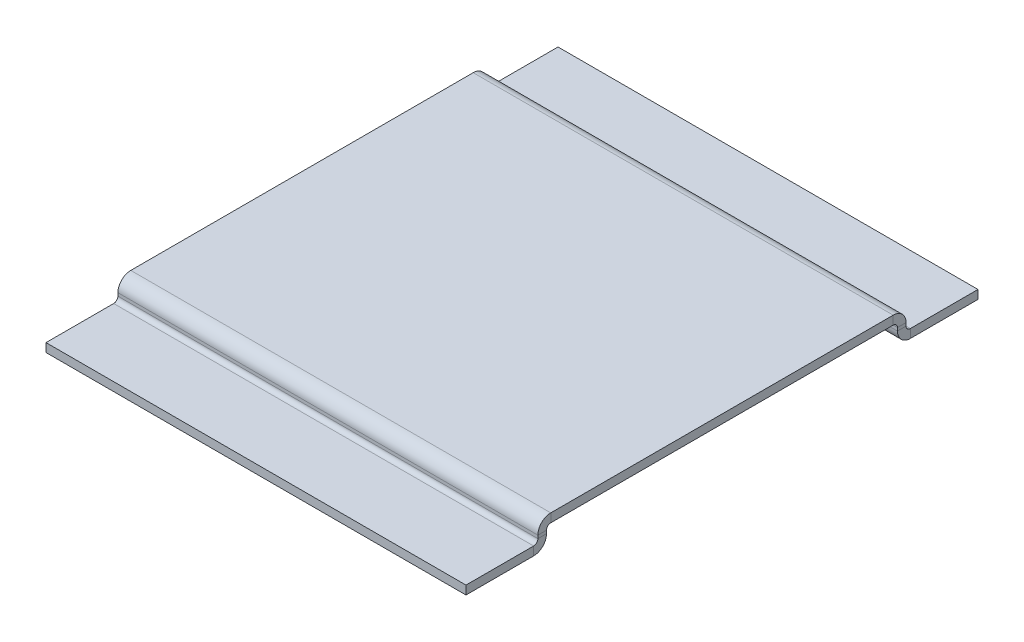
ISO-10303-21;
HEADER;
FILE_DESCRIPTION(('STEP AP214'),'2;1');
FILE_NAME('part.step','',(''),(''),'','','');
FILE_SCHEMA(('AUTOMOTIVE_DESIGN { 1 0 10303 214 1 1 1 1 }'));
ENDSEC;
DATA;
#1=APPLICATION_CONTEXT('core data for automotive mechanical design processes');
#2=APPLICATION_PROTOCOL_DEFINITION('international standard','automotive_design',2000,#1);
#3=PRODUCT_CONTEXT('',#1,'mechanical');
#4=PRODUCT('Part','Part','',(#3));
#5=PRODUCT_RELATED_PRODUCT_CATEGORY('part','',(#4));
#6=PRODUCT_DEFINITION_FORMATION('','',#4);
#7=PRODUCT_DEFINITION_CONTEXT('part definition',#1,'design');
#8=PRODUCT_DEFINITION('design','',#6,#7);
#9=PRODUCT_DEFINITION_SHAPE('','',#8);
#10=(LENGTH_UNIT() NAMED_UNIT(*) SI_UNIT(.MILLI.,.METRE.));
#11=(NAMED_UNIT(*) PLANE_ANGLE_UNIT() SI_UNIT($,.RADIAN.));
#12=(NAMED_UNIT(*) SI_UNIT($,.STERADIAN.) SOLID_ANGLE_UNIT());
#13=UNCERTAINTY_MEASURE_WITH_UNIT(LENGTH_MEASURE(1.E-05),#10,'distance_accuracy_value','');
#14=(GEOMETRIC_REPRESENTATION_CONTEXT(3) GLOBAL_UNCERTAINTY_ASSIGNED_CONTEXT((#13)) GLOBAL_UNIT_ASSIGNED_CONTEXT((#10,
#11,#12)) REPRESENTATION_CONTEXT('',''));
#15=CARTESIAN_POINT('',(0.,0.,0.));
#16=DIRECTION('',(0.,0.,1.));
#17=DIRECTION('',(1.,0.,0.));
#18=AXIS2_PLACEMENT_3D('',#15,#16,#17);
#19=CARTESIAN_POINT('',(-36.5,-1.49999999999999,-32.));
#20=DIRECTION('',(-1.,0.,0.));
#21=DIRECTION('',(0.,0.,1.));
#22=AXIS2_PLACEMENT_3D('',#19,#20,#21);
#23=PLANE('',#22);
#24=DIRECTION('',(0.,1.,0.));
#25=VECTOR('',#24,1.);
#26=CARTESIAN_POINT('',(-36.5,-1.49999999999999,-32.));
#27=LINE('',#26,#25);
#28=CARTESIAN_POINT('',(-36.5,-2.23659999999999,-32.));
#29=VERTEX_POINT('',#28);
#30=CARTESIAN_POINT('',(-36.5,-2.7634,-32.));
#31=VERTEX_POINT('',#30);
#32=EDGE_CURVE('E375',#29,#31,#27,.F.);
#33=ORIENTED_EDGE('',*,*,#32,.T.);
#34=DIRECTION('',(0.,0.,1.));
#35=VECTOR('',#34,1.);
#36=CARTESIAN_POINT('',(-36.5,-2.7634,-32.));
#37=LINE('',#36,#35);
#38=CARTESIAN_POINT('',(-36.5,-2.76340000000001,-30.5));
#39=VERTEX_POINT('',#38);
#40=EDGE_CURVE('E306',#31,#39,#37,.T.);
#41=ORIENTED_EDGE('',*,*,#40,.T.);
#42=DIRECTION('',(0.,-1.,0.));
#43=VECTOR('',#42,1.);
#44=CARTESIAN_POINT('',(-36.5,1.26882631385732E-13,-30.5));
#45=LINE('',#44,#43);
#46=CARTESIAN_POINT('',(-36.5,-2.2366,-30.5));
#47=VERTEX_POINT('',#46);
#48=EDGE_CURVE('E380',#47,#39,#45,.T.);
#49=ORIENTED_EDGE('',*,*,#48,.F.);
#50=DIRECTION('',(0.,0.,-1.));
#51=VECTOR('',#50,1.);
#52=CARTESIAN_POINT('',(-36.5,-2.23659999999999,-32.));
#53=LINE('',#52,#51);
#54=EDGE_CURVE('E370',#47,#29,#53,.T.);
#55=ORIENTED_EDGE('',*,*,#54,.T.);
#56=EDGE_LOOP('',(#33,#41,#49,#55));
#57=FACE_BOUND('',#56,.T.);
#58=ADVANCED_FACE('F119',(#57),#23,.T.);
#59=CARTESIAN_POINT('',(0.,1.32119853393997E-13,-32.));
#60=DIRECTION('',(0.,0.,1.));
#61=DIRECTION('',(0.,-1.,0.));
#62=AXIS2_PLACEMENT_3D('',#59,#60,#61);
#63=PLANE('',#62);
#64=DIRECTION('',(-1.,0.,0.));
#65=VECTOR('',#64,1.);
#66=CARTESIAN_POINT('',(-36.5,-2.7634,-32.));
#67=LINE('',#66,#65);
#68=CARTESIAN_POINT('',(36.5,-2.7634,-32.));
#69=VERTEX_POINT('',#68);
#70=EDGE_CURVE('E312',#31,#69,#67,.F.);
#71=ORIENTED_EDGE('',*,*,#70,.F.);
#72=ORIENTED_EDGE('',*,*,#32,.F.);
#73=DIRECTION('',(1.,0.,0.));
#74=VECTOR('',#73,1.);
#75=CARTESIAN_POINT('',(-36.5,-2.23659999999999,-32.));
#76=LINE('',#75,#74);
#77=CARTESIAN_POINT('',(36.5,-2.23659999999999,-32.));
#78=VERTEX_POINT('',#77);
#79=EDGE_CURVE('E383',#78,#29,#76,.F.);
#80=ORIENTED_EDGE('',*,*,#79,.F.);
#81=DIRECTION('',(0.,-1.,0.));
#82=VECTOR('',#81,1.);
#83=CARTESIAN_POINT('',(36.5,-5.,-32.));
#84=LINE('',#83,#82);
#85=EDGE_CURVE('E372',#69,#78,#84,.F.);
#86=ORIENTED_EDGE('',*,*,#85,.F.);
#87=EDGE_LOOP('',(#71,#72,#80,#86));
#88=FACE_BOUND('',#87,.T.);
#89=ADVANCED_FACE('F507',(#88),#63,.F.);
#90=CARTESIAN_POINT('',(0.,1.26882631385732E-13,-30.5));
#91=DIRECTION('',(0.,0.,1.));
#92=DIRECTION('',(0.,-1.,0.));
#93=AXIS2_PLACEMENT_3D('',#90,#91,#92);
#94=PLANE('',#93);
#95=ORIENTED_EDGE('',*,*,#48,.T.);
#96=DIRECTION('',(-1.,0.,0.));
#97=VECTOR('',#96,1.);
#98=CARTESIAN_POINT('',(-36.5,-2.76340000000001,-30.5));
#99=LINE('',#98,#97);
#100=CARTESIAN_POINT('',(36.5,-2.7634,-30.5));
#101=VERTEX_POINT('',#100);
#102=EDGE_CURVE('E301',#39,#101,#99,.F.);
#103=ORIENTED_EDGE('',*,*,#102,.T.);
#104=DIRECTION('',(0.,1.,0.));
#105=VECTOR('',#104,1.);
#106=CARTESIAN_POINT('',(36.5,1.26882631385732E-13,-30.5));
#107=LINE('',#106,#105);
#108=CARTESIAN_POINT('',(36.5,-2.2366,-30.5));
#109=VERTEX_POINT('',#108);
#110=EDGE_CURVE('E378',#101,#109,#107,.T.);
#111=ORIENTED_EDGE('',*,*,#110,.T.);
#112=DIRECTION('',(1.,0.,0.));
#113=VECTOR('',#112,1.);
#114=CARTESIAN_POINT('',(-36.5,-2.2366,-30.5));
#115=LINE('',#114,#113);
#116=EDGE_CURVE('E388',#47,#109,#115,.T.);
#117=ORIENTED_EDGE('',*,*,#116,.F.);
#118=EDGE_LOOP('',(#95,#103,#111,#117));
#119=FACE_BOUND('',#118,.T.);
#120=ADVANCED_FACE('F492',(#119),#94,.T.);
#121=CARTESIAN_POINT('',(36.5,-5.,32.));
#122=DIRECTION('',(1.,0.,0.));
#123=DIRECTION('',(0.,0.,-1.));
#124=AXIS2_PLACEMENT_3D('',#121,#122,#123);
#125=PLANE('',#124);
#126=DIRECTION('',(0.,-1.,0.));
#127=VECTOR('',#126,1.);
#128=CARTESIAN_POINT('',(36.5,-5.,32.));
#129=LINE('',#128,#127);
#130=CARTESIAN_POINT('',(36.5,-2.23659999999999,32.));
#131=VERTEX_POINT('',#130);
#132=CARTESIAN_POINT('',(36.5,-2.7634,32.));
#133=VERTEX_POINT('',#132);
#134=EDGE_CURVE('E419',#131,#133,#129,.T.);
#135=ORIENTED_EDGE('',*,*,#134,.T.);
#136=DIRECTION('',(0.,0.,-1.));
#137=VECTOR('',#136,1.);
#138=CARTESIAN_POINT('',(36.5,-2.7634,32.));
#139=LINE('',#138,#137);
#140=CARTESIAN_POINT('',(36.5,-2.76340000000001,30.5));
#141=VERTEX_POINT('',#140);
#142=EDGE_CURVE('E358',#133,#141,#139,.T.);
#143=ORIENTED_EDGE('',*,*,#142,.T.);
#144=DIRECTION('',(0.,1.,0.));
#145=VECTOR('',#144,1.);
#146=CARTESIAN_POINT('',(36.5,1.26882631385732E-13,30.5));
#147=LINE('',#146,#145);
#148=CARTESIAN_POINT('',(36.5,-2.2366,30.5));
#149=VERTEX_POINT('',#148);
#150=EDGE_CURVE('E424',#149,#141,#147,.F.);
#151=ORIENTED_EDGE('',*,*,#150,.F.);
#152=DIRECTION('',(0.,0.,1.));
#153=VECTOR('',#152,1.);
#154=CARTESIAN_POINT('',(36.5,-2.2366,32.));
#155=LINE('',#154,#153);
#156=EDGE_CURVE('E413',#149,#131,#155,.T.);
#157=ORIENTED_EDGE('',*,*,#156,.T.);
#158=EDGE_LOOP('',(#135,#143,#151,#157));
#159=FACE_BOUND('',#158,.T.);
#160=ADVANCED_FACE('F533',(#159),#125,.T.);
#161=CARTESIAN_POINT('',(0.,1.32119853393997E-13,32.));
#162=DIRECTION('',(0.,0.,1.));
#163=DIRECTION('',(0.,-1.,0.));
#164=AXIS2_PLACEMENT_3D('',#161,#162,#163);
#165=PLANE('',#164);
#166=DIRECTION('',(0.,1.,0.));
#167=VECTOR('',#166,1.);
#168=CARTESIAN_POINT('',(-36.5,-1.49999999999999,32.));
#169=LINE('',#168,#167);
#170=CARTESIAN_POINT('',(-36.5,-2.76339999999999,32.));
#171=VERTEX_POINT('',#170);
#172=CARTESIAN_POINT('',(-36.5,-2.23660000000001,32.));
#173=VERTEX_POINT('',#172);
#174=EDGE_CURVE('E416',#171,#173,#169,.T.);
#175=ORIENTED_EDGE('',*,*,#174,.F.);
#176=DIRECTION('',(1.,0.,0.));
#177=VECTOR('',#176,1.);
#178=CARTESIAN_POINT('',(36.5,-2.7634,32.));
#179=LINE('',#178,#177);
#180=EDGE_CURVE('E364',#133,#171,#179,.F.);
#181=ORIENTED_EDGE('',*,*,#180,.F.);
#182=ORIENTED_EDGE('',*,*,#134,.F.);
#183=DIRECTION('',(-1.,0.,0.));
#184=VECTOR('',#183,1.);
#185=CARTESIAN_POINT('',(0.,-2.2366,32.));
#186=LINE('',#185,#184);
#187=EDGE_CURVE('E427',#131,#173,#186,.T.);
#188=ORIENTED_EDGE('',*,*,#187,.T.);
#189=EDGE_LOOP('',(#175,#181,#182,#188));
#190=FACE_BOUND('',#189,.T.);
#191=ADVANCED_FACE('F748',(#190),#165,.T.);
#192=CARTESIAN_POINT('',(0.,1.26882631385732E-13,30.5));
#193=DIRECTION('',(0.,0.,1.));
#194=DIRECTION('',(0.,-1.,0.));
#195=AXIS2_PLACEMENT_3D('',#192,#193,#194);
#196=PLANE('',#195);
#197=DIRECTION('',(1.,0.,0.));
#198=VECTOR('',#197,1.);
#199=CARTESIAN_POINT('',(36.5,-2.76340000000001,30.5));
#200=LINE('',#199,#198);
#201=CARTESIAN_POINT('',(-36.5,-2.76339999999999,30.5));
#202=VERTEX_POINT('',#201);
#203=EDGE_CURVE('E352',#141,#202,#200,.F.);
#204=ORIENTED_EDGE('',*,*,#203,.T.);
#205=DIRECTION('',(0.,-1.,0.));
#206=VECTOR('',#205,1.);
#207=CARTESIAN_POINT('',(-36.5,1.26882631385732E-13,30.5));
#208=LINE('',#207,#206);
#209=CARTESIAN_POINT('',(-36.5,-2.2366,30.5));
#210=VERTEX_POINT('',#209);
#211=EDGE_CURVE('E422',#202,#210,#208,.F.);
#212=ORIENTED_EDGE('',*,*,#211,.T.);
#213=DIRECTION('',(1.,0.,0.));
#214=VECTOR('',#213,1.);
#215=CARTESIAN_POINT('',(36.5,-2.2366,30.5));
#216=LINE('',#215,#214);
#217=EDGE_CURVE('E433',#149,#210,#216,.F.);
#218=ORIENTED_EDGE('',*,*,#217,.F.);
#219=ORIENTED_EDGE('',*,*,#150,.T.);
#220=EDGE_LOOP('',(#204,#212,#218,#219));
#221=FACE_BOUND('',#220,.T.);
#222=ADVANCED_FACE('F758',(#221),#196,.F.);
#223=CARTESIAN_POINT('',(0.,-1.5,0.));
#224=DIRECTION('',(0.,1.,0.));
#225=DIRECTION('',(0.,0.,1.));
#226=AXIS2_PLACEMENT_3D('',#223,#224,#225);
#227=PLANE('',#226);
#228=DIRECTION('',(1.,0.,0.));
#229=VECTOR('',#228,1.);
#230=CARTESIAN_POINT('',(36.5,-1.50000000000001,-29.7634));
#231=LINE('',#230,#229);
#232=CARTESIAN_POINT('',(36.5,-1.50000000000001,-29.7634));
#233=VERTEX_POINT('',#232);
#234=CARTESIAN_POINT('',(-36.5,-1.50000000000001,-29.7634));
#235=VERTEX_POINT('',#234);
#236=EDGE_CURVE('E406',#233,#235,#231,.F.);
#237=ORIENTED_EDGE('',*,*,#236,.F.);
#238=DIRECTION('',(0.,0.,-1.));
#239=VECTOR('',#238,1.);
#240=CARTESIAN_POINT('',(36.5,-1.5,32.));
#241=LINE('',#240,#239);
#242=CARTESIAN_POINT('',(36.5,-1.50000000000001,29.7634));
#243=VERTEX_POINT('',#242);
#244=EDGE_CURVE('E13',#243,#233,#241,.T.);
#245=ORIENTED_EDGE('',*,*,#244,.F.);
#246=DIRECTION('',(-1.,0.,0.));
#247=VECTOR('',#246,1.);
#248=CARTESIAN_POINT('',(-36.5,-1.50000000000001,29.7634));
#249=LINE('',#248,#247);
#250=CARTESIAN_POINT('',(-36.5,-1.50000000000001,29.7634));
#251=VERTEX_POINT('',#250);
#252=EDGE_CURVE('E451',#251,#243,#249,.F.);
#253=ORIENTED_EDGE('',*,*,#252,.F.);
#254=DIRECTION('',(0.,0.,1.));
#255=VECTOR('',#254,1.);
#256=CARTESIAN_POINT('',(-36.5,-1.5,32.));
#257=LINE('',#256,#255);
#258=EDGE_CURVE('E128',#235,#251,#257,.T.);
#259=ORIENTED_EDGE('',*,*,#258,.F.);
#260=EDGE_LOOP('',(#237,#245,#253,#259));
#261=FACE_BOUND('',#260,.T.);
#262=ADVANCED_FACE('F484',(#261),#227,.F.);
#263=CARTESIAN_POINT('',(0.,0.,0.));
#264=DIRECTION('',(0.,1.,0.));
#265=DIRECTION('',(0.,0.,1.));
#266=AXIS2_PLACEMENT_3D('',#263,#264,#265);
#267=PLANE('',#266);
#268=DIRECTION('',(0.,0.,-1.));
#269=VECTOR('',#268,1.);
#270=CARTESIAN_POINT('',(36.5,0.,32.));
#271=LINE('',#270,#269);
#272=CARTESIAN_POINT('',(36.5,0.,29.7634));
#273=VERTEX_POINT('',#272);
#274=CARTESIAN_POINT('',(36.5,0.,-29.7634));
#275=VERTEX_POINT('',#274);
#276=EDGE_CURVE('E123',#273,#275,#271,.T.);
#277=ORIENTED_EDGE('',*,*,#276,.T.);
#278=DIRECTION('',(1.,0.,0.));
#279=VECTOR('',#278,1.);
#280=CARTESIAN_POINT('',(36.5,0.,-29.7634));
#281=LINE('',#280,#279);
#282=CARTESIAN_POINT('',(-36.5,0.,-29.7634));
#283=VERTEX_POINT('',#282);
#284=EDGE_CURVE('E393',#275,#283,#281,.F.);
#285=ORIENTED_EDGE('',*,*,#284,.T.);
#286=DIRECTION('',(0.,0.,1.));
#287=VECTOR('',#286,1.);
#288=CARTESIAN_POINT('',(-36.5,0.,32.));
#289=LINE('',#288,#287);
#290=CARTESIAN_POINT('',(-36.5,0.,29.7634));
#291=VERTEX_POINT('',#290);
#292=EDGE_CURVE('E458',#283,#291,#289,.T.);
#293=ORIENTED_EDGE('',*,*,#292,.T.);
#294=DIRECTION('',(-1.,0.,0.));
#295=VECTOR('',#294,1.);
#296=CARTESIAN_POINT('',(-36.5,0.,29.7634));
#297=LINE('',#296,#295);
#298=EDGE_CURVE('E438',#291,#273,#297,.F.);
#299=ORIENTED_EDGE('',*,*,#298,.T.);
#300=EDGE_LOOP('',(#277,#285,#293,#299));
#301=FACE_BOUND('',#300,.T.);
#302=ADVANCED_FACE('F467',(#301),#267,.T.);
#303=CARTESIAN_POINT('',(36.5,-1.5,32.));
#304=DIRECTION('',(1.,0.,0.));
#305=DIRECTION('',(0.,0.,-1.));
#306=AXIS2_PLACEMENT_3D('',#303,#304,#305);
#307=PLANE('',#306);
#308=ORIENTED_EDGE('',*,*,#244,.T.);
#309=DIRECTION('',(0.,1.,0.));
#310=VECTOR('',#309,1.);
#311=CARTESIAN_POINT('',(36.5,-1.50000000000001,-29.7634));
#312=LINE('',#311,#310);
#313=EDGE_CURVE('E400',#233,#275,#312,.T.);
#314=ORIENTED_EDGE('',*,*,#313,.T.);
#315=ORIENTED_EDGE('',*,*,#276,.F.);
#316=DIRECTION('',(0.,1.,0.));
#317=VECTOR('',#316,1.);
#318=CARTESIAN_POINT('',(36.5,-1.50000000000001,29.7634));
#319=LINE('',#318,#317);
#320=EDGE_CURVE('E455',#243,#273,#319,.T.);
#321=ORIENTED_EDGE('',*,*,#320,.F.);
#322=EDGE_LOOP('',(#308,#314,#315,#321));
#323=FACE_BOUND('',#322,.T.);
#324=ADVANCED_FACE('F470',(#323),#307,.T.);
#325=CARTESIAN_POINT('',(-36.5,-1.5,32.));
#326=DIRECTION('',(-1.,0.,0.));
#327=DIRECTION('',(0.,0.,1.));
#328=AXIS2_PLACEMENT_3D('',#325,#326,#327);
#329=PLANE('',#328);
#330=DIRECTION('',(0.,1.,0.));
#331=VECTOR('',#330,1.);
#332=CARTESIAN_POINT('',(-36.5,-1.50000000000001,-29.7634));
#333=LINE('',#332,#331);
#334=EDGE_CURVE('E410',#235,#283,#333,.T.);
#335=ORIENTED_EDGE('',*,*,#334,.F.);
#336=ORIENTED_EDGE('',*,*,#258,.T.);
#337=DIRECTION('',(0.,1.,0.));
#338=VECTOR('',#337,1.);
#339=CARTESIAN_POINT('',(-36.5,-1.50000000000001,29.7634));
#340=LINE('',#339,#338);
#341=EDGE_CURVE('E445',#251,#291,#340,.T.);
#342=ORIENTED_EDGE('',*,*,#341,.T.);
#343=ORIENTED_EDGE('',*,*,#292,.F.);
#344=EDGE_LOOP('',(#335,#336,#342,#343));
#345=FACE_BOUND('',#344,.T.);
#346=ADVANCED_FACE('F121',(#345),#329,.T.);
#347=CARTESIAN_POINT('',(36.5,-2.2366,29.7634));
#348=DIRECTION('',(1.,0.,0.));
#349=DIRECTION('',(0.,0.,-1.));
#350=AXIS2_PLACEMENT_3D('',#347,#348,#349);
#351=PLANE('',#350);
#352=ORIENTED_EDGE('',*,*,#156,.F.);
#353=CARTESIAN_POINT('',(36.5,-2.2366,29.7634));
#354=DIRECTION('',(-1.,0.,0.));
#355=DIRECTION('',(0.,0.,1.));
#356=AXIS2_PLACEMENT_3D('',#353,#354,#355);
#357=CIRCLE('',#356,0.736599999999993);
#358=EDGE_CURVE('E448',#243,#149,#357,.F.);
#359=ORIENTED_EDGE('',*,*,#358,.F.);
#360=ORIENTED_EDGE('',*,*,#320,.T.);
#361=CARTESIAN_POINT('',(36.5,-2.2366,29.7634));
#362=DIRECTION('',(-1.,0.,0.));
#363=DIRECTION('',(0.,0.,1.));
#364=AXIS2_PLACEMENT_3D('',#361,#362,#363);
#365=CIRCLE('',#364,2.23659999999999);
#366=EDGE_CURVE('E441',#273,#131,#365,.F.);
#367=ORIENTED_EDGE('',*,*,#366,.T.);
#368=EDGE_LOOP('',(#352,#359,#360,#367));
#369=FACE_BOUND('',#368,.T.);
#370=ADVANCED_FACE('F846',(#369),#351,.T.);
#371=CARTESIAN_POINT('',(-36.5,-2.2366,29.7634));
#372=DIRECTION('',(1.,0.,0.));
#373=DIRECTION('',(0.,0.,-1.));
#374=AXIS2_PLACEMENT_3D('',#371,#372,#373);
#375=PLANE('',#374);
#376=CARTESIAN_POINT('',(-36.5,-2.2366,29.7634));
#377=DIRECTION('',(-1.,0.,0.));
#378=DIRECTION('',(0.,0.,1.));
#379=AXIS2_PLACEMENT_3D('',#376,#377,#378);
#380=CIRCLE('',#379,0.736599999999993);
#381=EDGE_CURVE('E418',#210,#251,#380,.T.);
#382=ORIENTED_EDGE('',*,*,#381,.F.);
#383=DIRECTION('',(0.,0.,1.));
#384=VECTOR('',#383,1.);
#385=CARTESIAN_POINT('',(-36.5,-2.23660000000001,30.5));
#386=LINE('',#385,#384);
#387=EDGE_CURVE('E430',#210,#173,#386,.T.);
#388=ORIENTED_EDGE('',*,*,#387,.T.);
#389=CARTESIAN_POINT('',(-36.5,-2.2366,29.7634));
#390=DIRECTION('',(-1.,0.,0.));
#391=DIRECTION('',(0.,0.,1.));
#392=AXIS2_PLACEMENT_3D('',#389,#390,#391);
#393=CIRCLE('',#392,2.23659999999999);
#394=EDGE_CURVE('E442',#173,#291,#393,.T.);
#395=ORIENTED_EDGE('',*,*,#394,.T.);
#396=ORIENTED_EDGE('',*,*,#341,.F.);
#397=EDGE_LOOP('',(#382,#388,#395,#396));
#398=FACE_BOUND('',#397,.T.);
#399=ADVANCED_FACE('F835',(#398),#375,.F.);
#400=CARTESIAN_POINT('',(-36.5,-2.2366,29.7634));
#401=DIRECTION('',(-1.,0.,0.));
#402=DIRECTION('',(0.,0.,1.));
#403=AXIS2_PLACEMENT_3D('',#400,#401,#402);
#404=CYLINDRICAL_SURFACE('',#403,2.23659999999999);
#405=ORIENTED_EDGE('',*,*,#298,.F.);
#406=ORIENTED_EDGE('',*,*,#394,.F.);
#407=ORIENTED_EDGE('',*,*,#187,.F.);
#408=ORIENTED_EDGE('',*,*,#366,.F.);
#409=EDGE_LOOP('',(#405,#406,#407,#408));
#410=FACE_BOUND('',#409,.T.);
#411=ADVANCED_FACE('F824',(#410),#404,.T.);
#412=CARTESIAN_POINT('',(-36.5,-2.2366,29.7634));
#413=DIRECTION('',(-1.,0.,0.));
#414=DIRECTION('',(0.,0.,1.));
#415=AXIS2_PLACEMENT_3D('',#412,#413,#414);
#416=CYLINDRICAL_SURFACE('',#415,0.736599999999993);
#417=ORIENTED_EDGE('',*,*,#252,.T.);
#418=ORIENTED_EDGE('',*,*,#358,.T.);
#419=ORIENTED_EDGE('',*,*,#217,.T.);
#420=ORIENTED_EDGE('',*,*,#381,.T.);
#421=EDGE_LOOP('',(#417,#418,#419,#420));
#422=FACE_BOUND('',#421,.T.);
#423=ADVANCED_FACE('F815',(#422),#416,.F.);
#424=CARTESIAN_POINT('',(-36.5,-1.49999999999999,32.));
#425=DIRECTION('',(-1.,0.,0.));
#426=DIRECTION('',(0.,0.,1.));
#427=AXIS2_PLACEMENT_3D('',#424,#425,#426);
#428=PLANE('',#427);
#429=DIRECTION('',(0.,0.,-1.));
#430=VECTOR('',#429,1.);
#431=CARTESIAN_POINT('',(-36.5,-2.7634,32.));
#432=LINE('',#431,#430);
#433=EDGE_CURVE('E144',#171,#202,#432,.T.);
#434=ORIENTED_EDGE('',*,*,#433,.F.);
#435=ORIENTED_EDGE('',*,*,#174,.T.);
#436=ORIENTED_EDGE('',*,*,#387,.F.);
#437=ORIENTED_EDGE('',*,*,#211,.F.);
#438=EDGE_LOOP('',(#434,#435,#436,#437));
#439=FACE_BOUND('',#438,.T.);
#440=ADVANCED_FACE('F805',(#439),#428,.T.);
#441=CARTESIAN_POINT('',(-36.5,-2.2366,-29.7634));
#442=DIRECTION('',(-1.,0.,0.));
#443=DIRECTION('',(0.,0.,1.));
#444=AXIS2_PLACEMENT_3D('',#441,#442,#443);
#445=PLANE('',#444);
#446=ORIENTED_EDGE('',*,*,#54,.F.);
#447=CARTESIAN_POINT('',(-36.5,-2.2366,-29.7634));
#448=DIRECTION('',(1.,0.,0.));
#449=DIRECTION('',(0.,0.,-1.));
#450=AXIS2_PLACEMENT_3D('',#447,#448,#449);
#451=CIRCLE('',#450,0.736599999999993);
#452=EDGE_CURVE('E403',#235,#47,#451,.F.);
#453=ORIENTED_EDGE('',*,*,#452,.F.);
#454=ORIENTED_EDGE('',*,*,#334,.T.);
#455=CARTESIAN_POINT('',(-36.5,-2.2366,-29.7634));
#456=DIRECTION('',(1.,0.,0.));
#457=DIRECTION('',(0.,0.,-1.));
#458=AXIS2_PLACEMENT_3D('',#455,#456,#457);
#459=CIRCLE('',#458,2.23659999999999);
#460=EDGE_CURVE('E396',#283,#29,#459,.F.);
#461=ORIENTED_EDGE('',*,*,#460,.T.);
#462=EDGE_LOOP('',(#446,#453,#454,#461));
#463=FACE_BOUND('',#462,.T.);
#464=ADVANCED_FACE('F489',(#463),#445,.T.);
#465=CARTESIAN_POINT('',(36.5,-2.2366,-29.7634));
#466=DIRECTION('',(-1.,0.,0.));
#467=DIRECTION('',(0.,0.,1.));
#468=AXIS2_PLACEMENT_3D('',#465,#466,#467);
#469=PLANE('',#468);
#470=CARTESIAN_POINT('',(36.5,-2.2366,-29.7634));
#471=DIRECTION('',(1.,0.,0.));
#472=DIRECTION('',(0.,0.,-1.));
#473=AXIS2_PLACEMENT_3D('',#470,#471,#472);
#474=CIRCLE('',#473,0.736599999999993);
#475=EDGE_CURVE('E374',#109,#233,#474,.T.);
#476=ORIENTED_EDGE('',*,*,#475,.F.);
#477=DIRECTION('',(0.,0.,-1.));
#478=VECTOR('',#477,1.);
#479=CARTESIAN_POINT('',(36.5,-2.2366,-30.5));
#480=LINE('',#479,#478);
#481=EDGE_CURVE('E385',#109,#78,#480,.T.);
#482=ORIENTED_EDGE('',*,*,#481,.T.);
#483=CARTESIAN_POINT('',(36.5,-2.2366,-29.7634));
#484=DIRECTION('',(1.,0.,0.));
#485=DIRECTION('',(0.,0.,-1.));
#486=AXIS2_PLACEMENT_3D('',#483,#484,#485);
#487=CIRCLE('',#486,2.23659999999999);
#488=EDGE_CURVE('E397',#78,#275,#487,.T.);
#489=ORIENTED_EDGE('',*,*,#488,.T.);
#490=ORIENTED_EDGE('',*,*,#313,.F.);
#491=EDGE_LOOP('',(#476,#482,#489,#490));
#492=FACE_BOUND('',#491,.T.);
#493=ADVANCED_FACE('F474',(#492),#469,.F.);
#494=CARTESIAN_POINT('',(36.5,-2.2366,-29.7634));
#495=DIRECTION('',(1.,0.,0.));
#496=DIRECTION('',(0.,0.,-1.));
#497=AXIS2_PLACEMENT_3D('',#494,#495,#496);
#498=CYLINDRICAL_SURFACE('',#497,2.23659999999999);
#499=ORIENTED_EDGE('',*,*,#284,.F.);
#500=ORIENTED_EDGE('',*,*,#488,.F.);
#501=ORIENTED_EDGE('',*,*,#79,.T.);
#502=ORIENTED_EDGE('',*,*,#460,.F.);
#503=EDGE_LOOP('',(#499,#500,#501,#502));
#504=FACE_BOUND('',#503,.T.);
#505=ADVANCED_FACE('F513',(#504),#498,.T.);
#506=CARTESIAN_POINT('',(36.5,-2.2366,-29.7634));
#507=DIRECTION('',(1.,0.,0.));
#508=DIRECTION('',(0.,0.,-1.));
#509=AXIS2_PLACEMENT_3D('',#506,#507,#508);
#510=CYLINDRICAL_SURFACE('',#509,0.736599999999993);
#511=ORIENTED_EDGE('',*,*,#236,.T.);
#512=ORIENTED_EDGE('',*,*,#452,.T.);
#513=ORIENTED_EDGE('',*,*,#116,.T.);
#514=ORIENTED_EDGE('',*,*,#475,.T.);
#515=EDGE_LOOP('',(#511,#512,#513,#514));
#516=FACE_BOUND('',#515,.T.);
#517=ADVANCED_FACE('F479',(#516),#510,.F.);
#518=CARTESIAN_POINT('',(36.5,-5.,-32.));
#519=DIRECTION('',(1.,0.,0.));
#520=DIRECTION('',(0.,0.,-1.));
#521=AXIS2_PLACEMENT_3D('',#518,#519,#520);
#522=PLANE('',#521);
#523=DIRECTION('',(0.,0.,1.));
#524=VECTOR('',#523,1.);
#525=CARTESIAN_POINT('',(36.5,-2.7634,-32.));
#526=LINE('',#525,#524);
#527=EDGE_CURVE('E317',#69,#101,#526,.T.);
#528=ORIENTED_EDGE('',*,*,#527,.F.);
#529=ORIENTED_EDGE('',*,*,#85,.T.);
#530=ORIENTED_EDGE('',*,*,#481,.F.);
#531=ORIENTED_EDGE('',*,*,#110,.F.);
#532=EDGE_LOOP('',(#528,#529,#530,#531));
#533=FACE_BOUND('',#532,.T.);
#534=ADVANCED_FACE('F511',(#533),#522,.T.);
#535=CARTESIAN_POINT('',(-36.5,-2.7634,32.7366));
#536=DIRECTION('',(-1.,0.,0.));
#537=DIRECTION('',(0.,0.,1.));
#538=AXIS2_PLACEMENT_3D('',#535,#536,#537);
#539=PLANE('',#538);
#540=DIRECTION('',(0.,1.,0.));
#541=VECTOR('',#540,1.);
#542=CARTESIAN_POINT('',(-36.5,-5.,32.7366));
#543=LINE('',#542,#541);
#544=CARTESIAN_POINT('',(-36.5,-3.5,32.7366));
#545=VERTEX_POINT('',#544);
#546=CARTESIAN_POINT('',(-36.5,-5.,32.7366));
#547=VERTEX_POINT('',#546);
#548=EDGE_CURVE('E319',#545,#547,#543,.F.);
#549=ORIENTED_EDGE('',*,*,#548,.F.);
#550=CARTESIAN_POINT('',(-36.5,-2.7634,32.7366));
#551=DIRECTION('',(1.,0.,0.));
#552=DIRECTION('',(0.,0.,-1.));
#553=AXIS2_PLACEMENT_3D('',#550,#551,#552);
#554=CIRCLE('',#553,0.736599999999999);
#555=EDGE_CURVE('E361',#171,#545,#554,.F.);
#556=ORIENTED_EDGE('',*,*,#555,.F.);
#557=ORIENTED_EDGE('',*,*,#433,.T.);
#558=CARTESIAN_POINT('',(-36.5,-2.7634,32.7366));
#559=DIRECTION('',(1.,0.,0.));
#560=DIRECTION('',(0.,0.,-1.));
#561=AXIS2_PLACEMENT_3D('',#558,#559,#560);
#562=CIRCLE('',#561,2.2366);
#563=EDGE_CURVE('E354',#202,#547,#562,.F.);
#564=ORIENTED_EDGE('',*,*,#563,.T.);
#565=EDGE_LOOP('',(#549,#556,#557,#564));
#566=FACE_BOUND('',#565,.T.);
#567=ADVANCED_FACE('F531',(#566),#539,.T.);
#568=CARTESIAN_POINT('',(36.5,-2.7634,32.7366));
#569=DIRECTION('',(-1.,0.,0.));
#570=DIRECTION('',(0.,0.,1.));
#571=AXIS2_PLACEMENT_3D('',#568,#569,#570);
#572=PLANE('',#571);
#573=CARTESIAN_POINT('',(36.5,-2.7634,32.7366));
#574=DIRECTION('',(1.,0.,0.));
#575=DIRECTION('',(0.,0.,-1.));
#576=AXIS2_PLACEMENT_3D('',#573,#574,#575);
#577=CIRCLE('',#576,0.736599999999999);
#578=CARTESIAN_POINT('',(36.5,-3.5,32.7366));
#579=VERTEX_POINT('',#578);
#580=EDGE_CURVE('E325',#579,#133,#577,.T.);
#581=ORIENTED_EDGE('',*,*,#580,.F.);
#582=DIRECTION('',(0.,1.,0.));
#583=VECTOR('',#582,1.);
#584=CARTESIAN_POINT('',(36.5,-3.50000000000001,32.7366));
#585=LINE('',#584,#583);
#586=CARTESIAN_POINT('',(36.5,-5.,32.7366));
#587=VERTEX_POINT('',#586);
#588=EDGE_CURVE('E345',#579,#587,#585,.F.);
#589=ORIENTED_EDGE('',*,*,#588,.T.);
#590=CARTESIAN_POINT('',(36.5,-2.7634,32.7366));
#591=DIRECTION('',(1.,0.,0.));
#592=DIRECTION('',(0.,0.,-1.));
#593=AXIS2_PLACEMENT_3D('',#590,#591,#592);
#594=CIRCLE('',#593,2.2366);
#595=EDGE_CURVE('E355',#587,#141,#594,.T.);
#596=ORIENTED_EDGE('',*,*,#595,.T.);
#597=ORIENTED_EDGE('',*,*,#142,.F.);
#598=EDGE_LOOP('',(#581,#589,#596,#597));
#599=FACE_BOUND('',#598,.T.);
#600=ADVANCED_FACE('F535',(#599),#572,.F.);
#601=CARTESIAN_POINT('',(36.5,-2.7634,32.7366));
#602=DIRECTION('',(1.,0.,0.));
#603=DIRECTION('',(0.,-1.,0.));
#604=AXIS2_PLACEMENT_3D('',#601,#602,#603);
#605=CYLINDRICAL_SURFACE('',#604,2.2366);
#606=ORIENTED_EDGE('',*,*,#203,.F.);
#607=ORIENTED_EDGE('',*,*,#595,.F.);
#608=DIRECTION('',(1.,0.,0.));
#609=VECTOR('',#608,1.);
#610=CARTESIAN_POINT('',(-36.5,-5.,32.7366));
#611=LINE('',#610,#609);
#612=EDGE_CURVE('E343',#587,#547,#611,.F.);
#613=ORIENTED_EDGE('',*,*,#612,.T.);
#614=ORIENTED_EDGE('',*,*,#563,.F.);
#615=EDGE_LOOP('',(#606,#607,#613,#614));
#616=FACE_BOUND('',#615,.T.);
#617=ADVANCED_FACE('F538',(#616),#605,.T.);
#618=CARTESIAN_POINT('',(36.5,-2.7634,32.7366));
#619=DIRECTION('',(1.,0.,0.));
#620=DIRECTION('',(0.,-1.,0.));
#621=AXIS2_PLACEMENT_3D('',#618,#619,#620);
#622=CYLINDRICAL_SURFACE('',#621,0.736599999999999);
#623=ORIENTED_EDGE('',*,*,#180,.T.);
#624=ORIENTED_EDGE('',*,*,#555,.T.);
#625=DIRECTION('',(1.,0.,0.));
#626=VECTOR('',#625,1.);
#627=CARTESIAN_POINT('',(-36.5,-3.5,32.7366));
#628=LINE('',#627,#626);
#629=EDGE_CURVE('E348',#545,#579,#628,.T.);
#630=ORIENTED_EDGE('',*,*,#629,.T.);
#631=ORIENTED_EDGE('',*,*,#580,.T.);
#632=EDGE_LOOP('',(#623,#624,#630,#631));
#633=FACE_BOUND('',#632,.T.);
#634=ADVANCED_FACE('F543',(#633),#622,.F.);
#635=CARTESIAN_POINT('',(36.5,-5.,44.5));
#636=DIRECTION('',(-1.,0.,0.));
#637=DIRECTION('',(0.,-1.,0.));
#638=AXIS2_PLACEMENT_3D('',#635,#636,#637);
#639=PLANE('',#638);
#640=ORIENTED_EDGE('',*,*,#588,.F.);
#641=DIRECTION('',(0.,0.,-1.));
#642=VECTOR('',#641,1.);
#643=CARTESIAN_POINT('',(36.5,-3.49999999999999,44.5));
#644=LINE('',#643,#642);
#645=CARTESIAN_POINT('',(36.5,-3.49999999999999,44.5));
#646=VERTEX_POINT('',#645);
#647=EDGE_CURVE('E341',#579,#646,#644,.F.);
#648=ORIENTED_EDGE('',*,*,#647,.T.);
#649=DIRECTION('',(0.,1.,0.));
#650=VECTOR('',#649,1.);
#651=CARTESIAN_POINT('',(36.5,-5.,44.5));
#652=LINE('',#651,#650);
#653=CARTESIAN_POINT('',(36.5,-4.99999999999999,44.5));
#654=VERTEX_POINT('',#653);
#655=EDGE_CURVE('E322',#654,#646,#652,.T.);
#656=ORIENTED_EDGE('',*,*,#655,.F.);
#657=DIRECTION('',(0.,0.,1.));
#658=VECTOR('',#657,1.);
#659=CARTESIAN_POINT('',(36.5,-5.00000000000002,0.));
#660=LINE('',#659,#658);
#661=EDGE_CURVE('E334',#587,#654,#660,.T.);
#662=ORIENTED_EDGE('',*,*,#661,.F.);
#663=EDGE_LOOP('',(#640,#648,#656,#662));
#664=FACE_BOUND('',#663,.T.);
#665=ADVANCED_FACE('F546',(#664),#639,.F.);
#666=CARTESIAN_POINT('',(-36.5,-5.,32.));
#667=DIRECTION('',(1.,0.,0.));
#668=DIRECTION('',(0.,1.,0.));
#669=AXIS2_PLACEMENT_3D('',#666,#667,#668);
#670=PLANE('',#669);
#671=ORIENTED_EDGE('',*,*,#548,.T.);
#672=DIRECTION('',(0.,0.,-1.));
#673=VECTOR('',#672,1.);
#674=CARTESIAN_POINT('',(-36.5,-5.00000000000002,0.));
#675=LINE('',#674,#673);
#676=CARTESIAN_POINT('',(-36.5,-4.99999999999999,44.5));
#677=VERTEX_POINT('',#676);
#678=EDGE_CURVE('E329',#677,#547,#675,.T.);
#679=ORIENTED_EDGE('',*,*,#678,.F.);
#680=DIRECTION('',(0.,1.,0.));
#681=VECTOR('',#680,1.);
#682=CARTESIAN_POINT('',(-36.5,-4.99999999999999,44.5));
#683=LINE('',#682,#681);
#684=CARTESIAN_POINT('',(-36.5,-3.49999999999999,44.5));
#685=VERTEX_POINT('',#684);
#686=EDGE_CURVE('E326',#677,#685,#683,.T.);
#687=ORIENTED_EDGE('',*,*,#686,.T.);
#688=DIRECTION('',(0.,0.,1.));
#689=VECTOR('',#688,1.);
#690=CARTESIAN_POINT('',(-36.5,-3.5,32.));
#691=LINE('',#690,#689);
#692=EDGE_CURVE('E336',#685,#545,#691,.F.);
#693=ORIENTED_EDGE('',*,*,#692,.T.);
#694=EDGE_LOOP('',(#671,#679,#687,#693));
#695=FACE_BOUND('',#694,.T.);
#696=ADVANCED_FACE('F553',(#695),#670,.F.);
#697=CARTESIAN_POINT('',(0.,-5.00000000000002,0.));
#698=DIRECTION('',(0.,1.,0.));
#699=DIRECTION('',(0.,0.,1.));
#700=AXIS2_PLACEMENT_3D('',#697,#698,#699);
#701=PLANE('',#700);
#702=ORIENTED_EDGE('',*,*,#612,.F.);
#703=ORIENTED_EDGE('',*,*,#661,.T.);
#704=DIRECTION('',(-1.,0.,0.));
#705=VECTOR('',#704,1.);
#706=CARTESIAN_POINT('',(0.,-4.99999999999999,44.5));
#707=LINE('',#706,#705);
#708=EDGE_CURVE('E332',#654,#677,#707,.T.);
#709=ORIENTED_EDGE('',*,*,#708,.T.);
#710=ORIENTED_EDGE('',*,*,#678,.T.);
#711=EDGE_LOOP('',(#702,#703,#709,#710));
#712=FACE_BOUND('',#711,.T.);
#713=ADVANCED_FACE('F563',(#712),#701,.F.);
#714=CARTESIAN_POINT('',(0.,-3.50000000000002,0.));
#715=DIRECTION('',(0.,1.,0.));
#716=DIRECTION('',(0.,0.,1.));
#717=AXIS2_PLACEMENT_3D('',#714,#715,#716);
#718=PLANE('',#717);
#719=ORIENTED_EDGE('',*,*,#647,.F.);
#720=ORIENTED_EDGE('',*,*,#629,.F.);
#721=ORIENTED_EDGE('',*,*,#692,.F.);
#722=DIRECTION('',(1.,0.,0.));
#723=VECTOR('',#722,1.);
#724=CARTESIAN_POINT('',(-36.5,-3.49999999999999,44.5));
#725=LINE('',#724,#723);
#726=EDGE_CURVE('E339',#646,#685,#725,.F.);
#727=ORIENTED_EDGE('',*,*,#726,.F.);
#728=EDGE_LOOP('',(#719,#720,#721,#727));
#729=FACE_BOUND('',#728,.T.);
#730=ADVANCED_FACE('F559',(#729),#718,.T.);
#731=CARTESIAN_POINT('',(-36.5,-5.,44.5));
#732=DIRECTION('',(0.,0.,-1.));
#733=DIRECTION('',(0.,1.,0.));
#734=AXIS2_PLACEMENT_3D('',#731,#732,#733);
#735=PLANE('',#734);
#736=ORIENTED_EDGE('',*,*,#726,.T.);
#737=ORIENTED_EDGE('',*,*,#686,.F.);
#738=ORIENTED_EDGE('',*,*,#708,.F.);
#739=ORIENTED_EDGE('',*,*,#655,.T.);
#740=EDGE_LOOP('',(#736,#737,#738,#739));
#741=FACE_BOUND('',#740,.T.);
#742=ADVANCED_FACE('F555',(#741),#735,.F.);
#743=CARTESIAN_POINT('',(36.5,-2.7634,-32.7366));
#744=DIRECTION('',(1.,0.,0.));
#745=DIRECTION('',(0.,0.,-1.));
#746=AXIS2_PLACEMENT_3D('',#743,#744,#745);
#747=PLANE('',#746);
#748=DIRECTION('',(0.,1.,0.));
#749=VECTOR('',#748,1.);
#750=CARTESIAN_POINT('',(36.5,-5.,-32.7366));
#751=LINE('',#750,#749);
#752=CARTESIAN_POINT('',(36.5,-3.5,-32.7366));
#753=VERTEX_POINT('',#752);
#754=CARTESIAN_POINT('',(36.5,-5.,-32.7366));
#755=VERTEX_POINT('',#754);
#756=EDGE_CURVE('E283',#753,#755,#751,.F.);
#757=ORIENTED_EDGE('',*,*,#756,.F.);
#758=CARTESIAN_POINT('',(36.5,-2.7634,-32.7366));
#759=DIRECTION('',(-1.,0.,0.));
#760=DIRECTION('',(0.,0.,1.));
#761=AXIS2_PLACEMENT_3D('',#758,#759,#760);
#762=CIRCLE('',#761,0.736599999999999);
#763=EDGE_CURVE('E309',#69,#753,#762,.F.);
#764=ORIENTED_EDGE('',*,*,#763,.F.);
#765=ORIENTED_EDGE('',*,*,#527,.T.);
#766=CARTESIAN_POINT('',(36.5,-2.7634,-32.7366));
#767=DIRECTION('',(-1.,0.,0.));
#768=DIRECTION('',(0.,0.,1.));
#769=AXIS2_PLACEMENT_3D('',#766,#767,#768);
#770=CIRCLE('',#769,2.2366);
#771=EDGE_CURVE('E136',#101,#755,#770,.F.);
#772=ORIENTED_EDGE('',*,*,#771,.T.);
#773=EDGE_LOOP('',(#757,#764,#765,#772));
#774=FACE_BOUND('',#773,.T.);
#775=ADVANCED_FACE('F558',(#774),#747,.T.);
#776=CARTESIAN_POINT('',(-36.5,-2.7634,-32.7366));
#777=DIRECTION('',(1.,0.,0.));
#778=DIRECTION('',(0.,0.,-1.));
#779=AXIS2_PLACEMENT_3D('',#776,#777,#778);
#780=PLANE('',#779);
#781=CARTESIAN_POINT('',(-36.5,-2.7634,-32.7366));
#782=DIRECTION('',(-1.,0.,0.));
#783=DIRECTION('',(0.,0.,1.));
#784=AXIS2_PLACEMENT_3D('',#781,#782,#783);
#785=CIRCLE('',#784,0.736599999999999);
#786=CARTESIAN_POINT('',(-36.5,-3.5,-32.7366));
#787=VERTEX_POINT('',#786);
#788=EDGE_CURVE('E314',#787,#31,#785,.T.);
#789=ORIENTED_EDGE('',*,*,#788,.F.);
#790=DIRECTION('',(0.,1.,0.));
#791=VECTOR('',#790,1.);
#792=CARTESIAN_POINT('',(-36.5,-3.50000000000001,-32.7366));
#793=LINE('',#792,#791);
#794=CARTESIAN_POINT('',(-36.5,-5.,-32.7366));
#795=VERTEX_POINT('',#794);
#796=EDGE_CURVE('E295',#787,#795,#793,.F.);
#797=ORIENTED_EDGE('',*,*,#796,.T.);
#798=CARTESIAN_POINT('',(-36.5,-2.7634,-32.7366));
#799=DIRECTION('',(-1.,0.,0.));
#800=DIRECTION('',(0.,0.,1.));
#801=AXIS2_PLACEMENT_3D('',#798,#799,#800);
#802=CIRCLE('',#801,2.2366);
#803=EDGE_CURVE('E304',#795,#39,#802,.T.);
#804=ORIENTED_EDGE('',*,*,#803,.T.);
#805=ORIENTED_EDGE('',*,*,#40,.F.);
#806=EDGE_LOOP('',(#789,#797,#804,#805));
#807=FACE_BOUND('',#806,.T.);
#808=ADVANCED_FACE('F498',(#807),#780,.F.);
#809=CARTESIAN_POINT('',(-36.5,-2.7634,-32.7366));
#810=DIRECTION('',(-1.,0.,0.));
#811=DIRECTION('',(0.,-1.,0.));
#812=AXIS2_PLACEMENT_3D('',#809,#810,#811);
#813=CYLINDRICAL_SURFACE('',#812,2.2366);
#814=ORIENTED_EDGE('',*,*,#102,.F.);
#815=ORIENTED_EDGE('',*,*,#803,.F.);
#816=DIRECTION('',(-1.,0.,0.));
#817=VECTOR('',#816,1.);
#818=CARTESIAN_POINT('',(36.5,-5.,-32.7366));
#819=LINE('',#818,#817);
#820=EDGE_CURVE('E293',#795,#755,#819,.F.);
#821=ORIENTED_EDGE('',*,*,#820,.T.);
#822=ORIENTED_EDGE('',*,*,#771,.F.);
#823=EDGE_LOOP('',(#814,#815,#821,#822));
#824=FACE_BOUND('',#823,.T.);
#825=ADVANCED_FACE('F573',(#824),#813,.T.);
#826=CARTESIAN_POINT('',(-36.5,-2.7634,-32.7366));
#827=DIRECTION('',(-1.,0.,0.));
#828=DIRECTION('',(0.,-1.,0.));
#829=AXIS2_PLACEMENT_3D('',#826,#827,#828);
#830=CYLINDRICAL_SURFACE('',#829,0.736599999999999);
#831=ORIENTED_EDGE('',*,*,#70,.T.);
#832=ORIENTED_EDGE('',*,*,#763,.T.);
#833=DIRECTION('',(-1.,0.,0.));
#834=VECTOR('',#833,1.);
#835=CARTESIAN_POINT('',(36.5,-3.5,-32.7366));
#836=LINE('',#835,#834);
#837=EDGE_CURVE('E298',#753,#787,#836,.T.);
#838=ORIENTED_EDGE('',*,*,#837,.T.);
#839=ORIENTED_EDGE('',*,*,#788,.T.);
#840=EDGE_LOOP('',(#831,#832,#838,#839));
#841=FACE_BOUND('',#840,.T.);
#842=ADVANCED_FACE('F502',(#841),#830,.F.);
#843=CARTESIAN_POINT('',(-36.5,-5.,-44.5));
#844=DIRECTION('',(1.,0.,0.));
#845=DIRECTION('',(0.,0.,-1.));
#846=AXIS2_PLACEMENT_3D('',#843,#844,#845);
#847=PLANE('',#846);
#848=ORIENTED_EDGE('',*,*,#796,.F.);
#849=DIRECTION('',(0.,0.,1.));
#850=VECTOR('',#849,1.);
#851=CARTESIAN_POINT('',(-36.5,-3.49999999999999,-44.5));
#852=LINE('',#851,#850);
#853=CARTESIAN_POINT('',(-36.5,-3.49999999999999,-44.5));
#854=VERTEX_POINT('',#853);
#855=EDGE_CURVE('E291',#787,#854,#852,.F.);
#856=ORIENTED_EDGE('',*,*,#855,.T.);
#857=DIRECTION('',(0.,1.,0.));
#858=VECTOR('',#857,1.);
#859=CARTESIAN_POINT('',(-36.5,-5.,-44.5));
#860=LINE('',#859,#858);
#861=CARTESIAN_POINT('',(-36.5,-4.99999999999999,-44.5));
#862=VERTEX_POINT('',#861);
#863=EDGE_CURVE('E279',#862,#854,#860,.T.);
#864=ORIENTED_EDGE('',*,*,#863,.F.);
#865=DIRECTION('',(0.,0.,-1.));
#866=VECTOR('',#865,1.);
#867=CARTESIAN_POINT('',(-36.5,-5.00000000000002,0.));
#868=LINE('',#867,#866);
#869=EDGE_CURVE('E266',#795,#862,#868,.T.);
#870=ORIENTED_EDGE('',*,*,#869,.F.);
#871=EDGE_LOOP('',(#848,#856,#864,#870));
#872=FACE_BOUND('',#871,.T.);
#873=ADVANCED_FACE('F579',(#872),#847,.F.);
#874=CARTESIAN_POINT('',(36.5,-5.,-32.));
#875=DIRECTION('',(-1.,0.,0.));
#876=DIRECTION('',(0.,0.,1.));
#877=AXIS2_PLACEMENT_3D('',#874,#875,#876);
#878=PLANE('',#877);
#879=ORIENTED_EDGE('',*,*,#756,.T.);
#880=DIRECTION('',(0.,0.,1.));
#881=VECTOR('',#880,1.);
#882=CARTESIAN_POINT('',(36.5,-5.00000000000002,0.));
#883=LINE('',#882,#881);
#884=CARTESIAN_POINT('',(36.5,-4.99999999999999,-44.5));
#885=VERTEX_POINT('',#884);
#886=EDGE_CURVE('E264',#885,#755,#883,.T.);
#887=ORIENTED_EDGE('',*,*,#886,.F.);
#888=DIRECTION('',(0.,1.,0.));
#889=VECTOR('',#888,1.);
#890=CARTESIAN_POINT('',(36.5,-4.99999999999999,-44.5));
#891=LINE('',#890,#889);
#892=CARTESIAN_POINT('',(36.5,-3.49999999999999,-44.5));
#893=VERTEX_POINT('',#892);
#894=EDGE_CURVE('E272',#885,#893,#891,.T.);
#895=ORIENTED_EDGE('',*,*,#894,.T.);
#896=DIRECTION('',(0.,0.,-1.));
#897=VECTOR('',#896,1.);
#898=CARTESIAN_POINT('',(36.5,-3.5,-32.));
#899=LINE('',#898,#897);
#900=EDGE_CURVE('E288',#893,#753,#899,.F.);
#901=ORIENTED_EDGE('',*,*,#900,.T.);
#902=EDGE_LOOP('',(#879,#887,#895,#901));
#903=FACE_BOUND('',#902,.T.);
#904=ADVANCED_FACE('F282',(#903),#878,.F.);
#905=CARTESIAN_POINT('',(0.,-5.00000000000002,0.));
#906=DIRECTION('',(0.,1.,0.));
#907=DIRECTION('',(0.,0.,1.));
#908=AXIS2_PLACEMENT_3D('',#905,#906,#907);
#909=PLANE('',#908);
#910=ORIENTED_EDGE('',*,*,#820,.F.);
#911=ORIENTED_EDGE('',*,*,#869,.T.);
#912=DIRECTION('',(1.,0.,0.));
#913=VECTOR('',#912,1.);
#914=CARTESIAN_POINT('',(0.,-4.99999999999999,-44.5));
#915=LINE('',#914,#913);
#916=EDGE_CURVE('E259',#862,#885,#915,.T.);
#917=ORIENTED_EDGE('',*,*,#916,.T.);
#918=ORIENTED_EDGE('',*,*,#886,.T.);
#919=EDGE_LOOP('',(#910,#911,#917,#918));
#920=FACE_BOUND('',#919,.T.);
#921=ADVANCED_FACE('F262',(#920),#909,.F.);
#922=CARTESIAN_POINT('',(0.,-3.50000000000002,0.));
#923=DIRECTION('',(0.,1.,0.));
#924=DIRECTION('',(0.,0.,1.));
#925=AXIS2_PLACEMENT_3D('',#922,#923,#924);
#926=PLANE('',#925);
#927=ORIENTED_EDGE('',*,*,#855,.F.);
#928=ORIENTED_EDGE('',*,*,#837,.F.);
#929=ORIENTED_EDGE('',*,*,#900,.F.);
#930=DIRECTION('',(-1.,0.,0.));
#931=VECTOR('',#930,1.);
#932=CARTESIAN_POINT('',(36.5,-3.49999999999999,-44.5));
#933=LINE('',#932,#931);
#934=EDGE_CURVE('E275',#854,#893,#933,.F.);
#935=ORIENTED_EDGE('',*,*,#934,.F.);
#936=EDGE_LOOP('',(#927,#928,#929,#935));
#937=FACE_BOUND('',#936,.T.);
#938=ADVANCED_FACE('F587',(#937),#926,.T.);
#939=CARTESIAN_POINT('',(36.5,-5.,-44.5));
#940=DIRECTION('',(0.,0.,1.));
#941=DIRECTION('',(0.,-1.,0.));
#942=AXIS2_PLACEMENT_3D('',#939,#940,#941);
#943=PLANE('',#942);
#944=ORIENTED_EDGE('',*,*,#934,.T.);
#945=ORIENTED_EDGE('',*,*,#894,.F.);
#946=ORIENTED_EDGE('',*,*,#916,.F.);
#947=ORIENTED_EDGE('',*,*,#863,.T.);
#948=EDGE_LOOP('',(#944,#945,#946,#947));
#949=FACE_BOUND('',#948,.T.);
#950=ADVANCED_FACE('F273',(#949),#943,.F.);
#951=CLOSED_SHELL('',(#58,#89,#120,#160,#191,#222,#262,#302,#324,#346,#370,#399,#411,#423,#440,
#464,#493,#505,#517,#534,#567,#600,#617,#634,#665,#696,#713,#730,#742,#775,#808,#825,#842,#873,
#904,#921,#938,#950));
#952=MANIFOLD_SOLID_BREP('B2',#951);
#953=ADVANCED_BREP_SHAPE_REPRESENTATION('',(#18,#952),#14);
#954=SHAPE_DEFINITION_REPRESENTATION(#9,#953);
ENDSEC;
END-ISO-10303-21;
